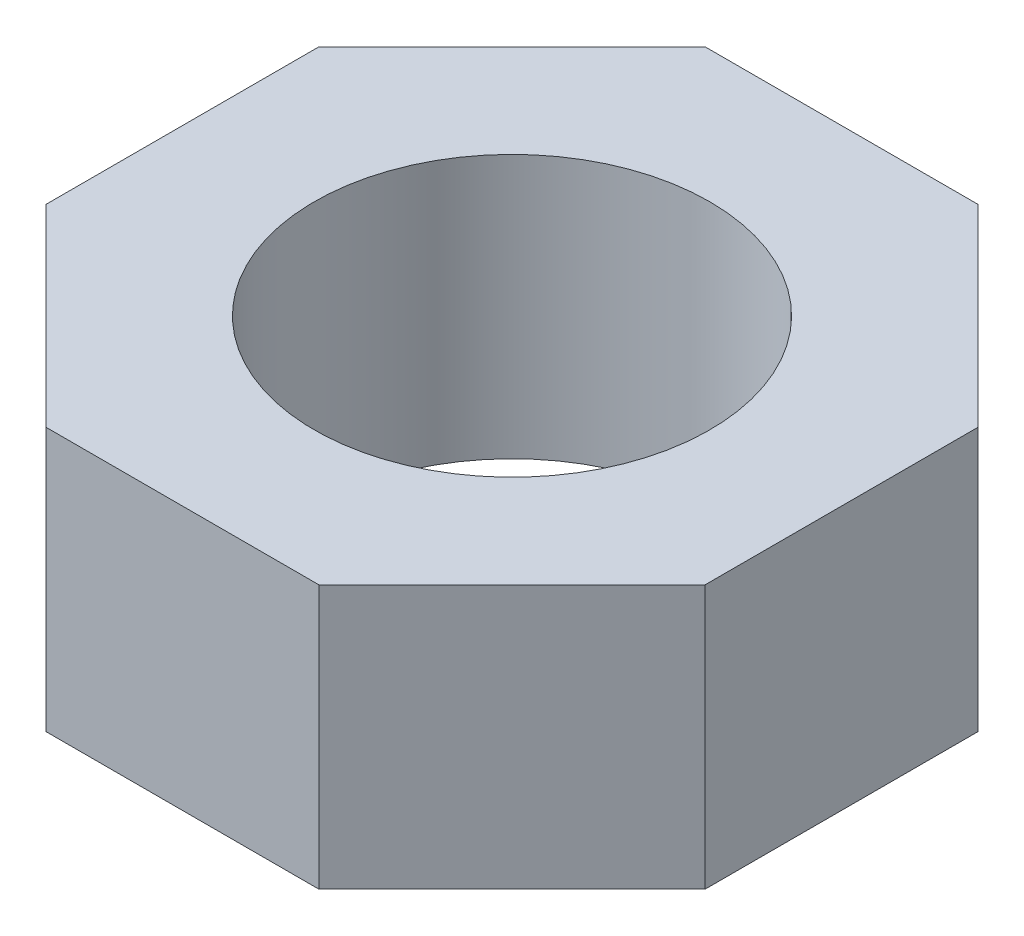
ISO-10303-21;
HEADER;
FILE_DESCRIPTION(('STEP AP214'),'2;1');
FILE_NAME('part.step','',(''),(''),'','','');
FILE_SCHEMA(('AUTOMOTIVE_DESIGN { 1 0 10303 214 1 1 1 1 }'));
ENDSEC;
DATA;
#1=APPLICATION_CONTEXT('core data for automotive mechanical design processes');
#2=APPLICATION_PROTOCOL_DEFINITION('international standard','automotive_design',2000,#1);
#3=PRODUCT_CONTEXT('',#1,'mechanical');
#4=PRODUCT('Part','Part','',(#3));
#5=PRODUCT_RELATED_PRODUCT_CATEGORY('part','',(#4));
#6=PRODUCT_DEFINITION_FORMATION('','',#4);
#7=PRODUCT_DEFINITION_CONTEXT('part definition',#1,'design');
#8=PRODUCT_DEFINITION('design','',#6,#7);
#9=PRODUCT_DEFINITION_SHAPE('','',#8);
#10=(LENGTH_UNIT() NAMED_UNIT(*) SI_UNIT(.MILLI.,.METRE.));
#11=(NAMED_UNIT(*) PLANE_ANGLE_UNIT() SI_UNIT($,.RADIAN.));
#12=(NAMED_UNIT(*) SI_UNIT($,.STERADIAN.) SOLID_ANGLE_UNIT());
#13=UNCERTAINTY_MEASURE_WITH_UNIT(LENGTH_MEASURE(1.E-05),#10,'distance_accuracy_value','');
#14=(GEOMETRIC_REPRESENTATION_CONTEXT(3) GLOBAL_UNCERTAINTY_ASSIGNED_CONTEXT((#13)) GLOBAL_UNIT_ASSIGNED_CONTEXT((#10,
#11,#12)) REPRESENTATION_CONTEXT('',''));
#15=CARTESIAN_POINT('',(0.,0.,0.));
#16=DIRECTION('',(0.,0.,1.));
#17=DIRECTION('',(1.,0.,0.));
#18=AXIS2_PLACEMENT_3D('',#15,#16,#17);
#19=CARTESIAN_POINT('',(-2.5,1.,-1.03553390593274));
#20=DIRECTION('',(0.707106781186547,0.,0.707106781186549));
#21=DIRECTION('',(0.707106781186549,0.,-0.707106781186547));
#22=AXIS2_PLACEMENT_3D('',#19,#20,#21);
#23=PLANE('',#22);
#24=DIRECTION('',(-0.707106781186549,0.,0.707106781186547));
#25=VECTOR('',#24,1.);
#26=CARTESIAN_POINT('',(-2.5,-1.,-1.03553390593274));
#27=LINE('',#26,#25);
#28=CARTESIAN_POINT('',(-1.03553390593274,-1.,-2.5));
#29=VERTEX_POINT('',#28);
#30=CARTESIAN_POINT('',(-2.5,-1.,-1.03553390593274));
#31=VERTEX_POINT('',#30);
#32=EDGE_CURVE('E128',#29,#31,#27,.T.);
#33=ORIENTED_EDGE('',*,*,#32,.T.);
#34=DIRECTION('',(0.,-1.,0.));
#35=VECTOR('',#34,1.);
#36=CARTESIAN_POINT('',(-2.5,1.,-1.03553390593274));
#37=LINE('',#36,#35);
#38=CARTESIAN_POINT('',(-2.5,1.,-1.03553390593274));
#39=VERTEX_POINT('',#38);
#40=EDGE_CURVE('E11',#39,#31,#37,.T.);
#41=ORIENTED_EDGE('',*,*,#40,.F.);
#42=DIRECTION('',(-0.707106781186549,0.,0.707106781186547));
#43=VECTOR('',#42,1.);
#44=CARTESIAN_POINT('',(-2.5,1.,-1.03553390593274));
#45=LINE('',#44,#43);
#46=CARTESIAN_POINT('',(-1.03553390593274,1.,-2.5));
#47=VERTEX_POINT('',#46);
#48=EDGE_CURVE('E143',#47,#39,#45,.T.);
#49=ORIENTED_EDGE('',*,*,#48,.F.);
#50=DIRECTION('',(0.,-1.,0.));
#51=VECTOR('',#50,1.);
#52=CARTESIAN_POINT('',(-1.03553390593274,1.,-2.5));
#53=LINE('',#52,#51);
#54=EDGE_CURVE('E124',#47,#29,#53,.T.);
#55=ORIENTED_EDGE('',*,*,#54,.T.);
#56=EDGE_LOOP('',(#33,#41,#49,#55));
#57=FACE_BOUND('',#56,.T.);
#58=ADVANCED_FACE('F32',(#57),#23,.F.);
#59=CARTESIAN_POINT('',(-2.5,1.,1.03553390593274));
#60=DIRECTION('',(1.,0.,0.));
#61=DIRECTION('',(0.,0.,-1.));
#62=AXIS2_PLACEMENT_3D('',#59,#60,#61);
#63=PLANE('',#62);
#64=DIRECTION('',(0.,0.,1.));
#65=VECTOR('',#64,1.);
#66=CARTESIAN_POINT('',(-2.5,-1.,1.03553390593274));
#67=LINE('',#66,#65);
#68=CARTESIAN_POINT('',(-2.5,-1.,1.03553390593274));
#69=VERTEX_POINT('',#68);
#70=EDGE_CURVE('E131',#31,#69,#67,.T.);
#71=ORIENTED_EDGE('',*,*,#70,.T.);
#72=DIRECTION('',(0.,-1.,0.));
#73=VECTOR('',#72,1.);
#74=CARTESIAN_POINT('',(-2.5,1.,1.03553390593274));
#75=LINE('',#74,#73);
#76=CARTESIAN_POINT('',(-2.5,1.,1.03553390593274));
#77=VERTEX_POINT('',#76);
#78=EDGE_CURVE('E40',#77,#69,#75,.T.);
#79=ORIENTED_EDGE('',*,*,#78,.F.);
#80=DIRECTION('',(0.,0.,1.));
#81=VECTOR('',#80,1.);
#82=CARTESIAN_POINT('',(-2.5,1.,1.03553390593274));
#83=LINE('',#82,#81);
#84=EDGE_CURVE('E91',#39,#77,#83,.T.);
#85=ORIENTED_EDGE('',*,*,#84,.F.);
#86=ORIENTED_EDGE('',*,*,#40,.T.);
#87=EDGE_LOOP('',(#71,#79,#85,#86));
#88=FACE_BOUND('',#87,.T.);
#89=ADVANCED_FACE('F198',(#88),#63,.F.);
#90=CARTESIAN_POINT('',(-1.03553390593274,1.,2.5));
#91=DIRECTION('',(0.707106781186547,0.,-0.707106781186548));
#92=DIRECTION('',(-0.707106781186548,0.,-0.707106781186547));
#93=AXIS2_PLACEMENT_3D('',#90,#91,#92);
#94=PLANE('',#93);
#95=DIRECTION('',(0.707106781186548,0.,0.707106781186547));
#96=VECTOR('',#95,1.);
#97=CARTESIAN_POINT('',(-1.03553390593274,-1.,2.5));
#98=LINE('',#97,#96);
#99=CARTESIAN_POINT('',(-1.03553390593274,-1.,2.5));
#100=VERTEX_POINT('',#99);
#101=EDGE_CURVE('E134',#69,#100,#98,.T.);
#102=ORIENTED_EDGE('',*,*,#101,.T.);
#103=DIRECTION('',(0.,-1.,0.));
#104=VECTOR('',#103,1.);
#105=CARTESIAN_POINT('',(-1.03553390593274,1.,2.5));
#106=LINE('',#105,#104);
#107=CARTESIAN_POINT('',(-1.03553390593274,1.,2.5));
#108=VERTEX_POINT('',#107);
#109=EDGE_CURVE('E150',#108,#100,#106,.T.);
#110=ORIENTED_EDGE('',*,*,#109,.F.);
#111=DIRECTION('',(0.707106781186548,0.,0.707106781186547));
#112=VECTOR('',#111,1.);
#113=CARTESIAN_POINT('',(-1.03553390593274,1.,2.5));
#114=LINE('',#113,#112);
#115=EDGE_CURVE('E158',#77,#108,#114,.T.);
#116=ORIENTED_EDGE('',*,*,#115,.F.);
#117=ORIENTED_EDGE('',*,*,#78,.T.);
#118=EDGE_LOOP('',(#102,#110,#116,#117));
#119=FACE_BOUND('',#118,.T.);
#120=ADVANCED_FACE('F156',(#119),#94,.F.);
#121=CARTESIAN_POINT('',(1.03553390593274,1.,2.5));
#122=DIRECTION('',(0.,0.,-1.));
#123=DIRECTION('',(-1.,0.,0.));
#124=AXIS2_PLACEMENT_3D('',#121,#122,#123);
#125=PLANE('',#124);
#126=DIRECTION('',(1.,0.,0.));
#127=VECTOR('',#126,1.);
#128=CARTESIAN_POINT('',(1.03553390593274,-1.,2.5));
#129=LINE('',#128,#127);
#130=CARTESIAN_POINT('',(1.03553390593274,-1.,2.5));
#131=VERTEX_POINT('',#130);
#132=EDGE_CURVE('E136',#100,#131,#129,.T.);
#133=ORIENTED_EDGE('',*,*,#132,.T.);
#134=DIRECTION('',(0.,-1.,0.));
#135=VECTOR('',#134,1.);
#136=CARTESIAN_POINT('',(1.03553390593274,1.,2.5));
#137=LINE('',#136,#135);
#138=CARTESIAN_POINT('',(1.03553390593274,1.,2.5));
#139=VERTEX_POINT('',#138);
#140=EDGE_CURVE('E147',#139,#131,#137,.T.);
#141=ORIENTED_EDGE('',*,*,#140,.F.);
#142=DIRECTION('',(1.,0.,0.));
#143=VECTOR('',#142,1.);
#144=CARTESIAN_POINT('',(1.03553390593274,1.,2.5));
#145=LINE('',#144,#143);
#146=EDGE_CURVE('E170',#108,#139,#145,.T.);
#147=ORIENTED_EDGE('',*,*,#146,.F.);
#148=ORIENTED_EDGE('',*,*,#109,.T.);
#149=EDGE_LOOP('',(#133,#141,#147,#148));
#150=FACE_BOUND('',#149,.T.);
#151=ADVANCED_FACE('F166',(#150),#125,.F.);
#152=CARTESIAN_POINT('',(2.5,1.,1.03553390593274));
#153=DIRECTION('',(-0.707106781186547,0.,-0.707106781186548));
#154=DIRECTION('',(-0.707106781186548,0.,0.707106781186547));
#155=AXIS2_PLACEMENT_3D('',#152,#153,#154);
#156=PLANE('',#155);
#157=DIRECTION('',(0.707106781186548,0.,-0.707106781186547));
#158=VECTOR('',#157,1.);
#159=CARTESIAN_POINT('',(2.5,-1.,1.03553390593274));
#160=LINE('',#159,#158);
#161=CARTESIAN_POINT('',(2.5,-1.,1.03553390593274));
#162=VERTEX_POINT('',#161);
#163=EDGE_CURVE('E138',#131,#162,#160,.T.);
#164=ORIENTED_EDGE('',*,*,#163,.T.);
#165=DIRECTION('',(0.,-1.,0.));
#166=VECTOR('',#165,1.);
#167=CARTESIAN_POINT('',(2.5,1.,1.03553390593274));
#168=LINE('',#167,#166);
#169=CARTESIAN_POINT('',(2.5,1.,1.03553390593274));
#170=VERTEX_POINT('',#169);
#171=EDGE_CURVE('E119',#170,#162,#168,.T.);
#172=ORIENTED_EDGE('',*,*,#171,.F.);
#173=DIRECTION('',(0.707106781186548,0.,-0.707106781186547));
#174=VECTOR('',#173,1.);
#175=CARTESIAN_POINT('',(2.5,1.,1.03553390593274));
#176=LINE('',#175,#174);
#177=EDGE_CURVE('E110',#139,#170,#176,.T.);
#178=ORIENTED_EDGE('',*,*,#177,.F.);
#179=ORIENTED_EDGE('',*,*,#140,.T.);
#180=EDGE_LOOP('',(#164,#172,#178,#179));
#181=FACE_BOUND('',#180,.T.);
#182=ADVANCED_FACE('F169',(#181),#156,.F.);
#183=CARTESIAN_POINT('',(2.5,1.,-1.03553390593274));
#184=DIRECTION('',(-1.,0.,0.));
#185=DIRECTION('',(0.,0.,1.));
#186=AXIS2_PLACEMENT_3D('',#183,#184,#185);
#187=PLANE('',#186);
#188=DIRECTION('',(0.,0.,-1.));
#189=VECTOR('',#188,1.);
#190=CARTESIAN_POINT('',(2.5,-1.,-1.03553390593274));
#191=LINE('',#190,#189);
#192=CARTESIAN_POINT('',(2.5,-1.,-1.03553390593274));
#193=VERTEX_POINT('',#192);
#194=EDGE_CURVE('E118',#162,#193,#191,.T.);
#195=ORIENTED_EDGE('',*,*,#194,.T.);
#196=DIRECTION('',(0.,-1.,0.));
#197=VECTOR('',#196,1.);
#198=CARTESIAN_POINT('',(2.5,1.,-1.03553390593274));
#199=LINE('',#198,#197);
#200=CARTESIAN_POINT('',(2.5,1.,-1.03553390593274));
#201=VERTEX_POINT('',#200);
#202=EDGE_CURVE('E115',#201,#193,#199,.T.);
#203=ORIENTED_EDGE('',*,*,#202,.F.);
#204=DIRECTION('',(0.,0.,-1.));
#205=VECTOR('',#204,1.);
#206=CARTESIAN_POINT('',(2.5,1.,-1.03553390593274));
#207=LINE('',#206,#205);
#208=EDGE_CURVE('E104',#170,#201,#207,.T.);
#209=ORIENTED_EDGE('',*,*,#208,.F.);
#210=ORIENTED_EDGE('',*,*,#171,.T.);
#211=EDGE_LOOP('',(#195,#203,#209,#210));
#212=FACE_BOUND('',#211,.T.);
#213=ADVANCED_FACE('F116',(#212),#187,.F.);
#214=CARTESIAN_POINT('',(1.03553390593274,1.,-2.5));
#215=DIRECTION('',(-0.707106781186547,0.,0.707106781186548));
#216=DIRECTION('',(0.707106781186548,0.,0.707106781186547));
#217=AXIS2_PLACEMENT_3D('',#214,#215,#216);
#218=PLANE('',#217);
#219=DIRECTION('',(-0.707106781186548,0.,-0.707106781186547));
#220=VECTOR('',#219,1.);
#221=CARTESIAN_POINT('',(1.03553390593274,-1.,-2.5));
#222=LINE('',#221,#220);
#223=CARTESIAN_POINT('',(1.03553390593274,-1.,-2.5));
#224=VERTEX_POINT('',#223);
#225=EDGE_CURVE('E77',#193,#224,#222,.T.);
#226=ORIENTED_EDGE('',*,*,#225,.T.);
#227=DIRECTION('',(0.,-1.,0.));
#228=VECTOR('',#227,1.);
#229=CARTESIAN_POINT('',(1.03553390593274,1.,-2.5));
#230=LINE('',#229,#228);
#231=CARTESIAN_POINT('',(1.03553390593274,1.,-2.5));
#232=VERTEX_POINT('',#231);
#233=EDGE_CURVE('E120',#232,#224,#230,.T.);
#234=ORIENTED_EDGE('',*,*,#233,.F.);
#235=DIRECTION('',(-0.707106781186548,0.,-0.707106781186547));
#236=VECTOR('',#235,1.);
#237=CARTESIAN_POINT('',(1.03553390593274,1.,-2.5));
#238=LINE('',#237,#236);
#239=EDGE_CURVE('E108',#201,#232,#238,.T.);
#240=ORIENTED_EDGE('',*,*,#239,.F.);
#241=ORIENTED_EDGE('',*,*,#202,.T.);
#242=EDGE_LOOP('',(#226,#234,#240,#241));
#243=FACE_BOUND('',#242,.T.);
#244=ADVANCED_FACE('F122',(#243),#218,.F.);
#245=CARTESIAN_POINT('',(-1.03553390593274,1.,-2.5));
#246=DIRECTION('',(0.,0.,1.));
#247=DIRECTION('',(1.,0.,0.));
#248=AXIS2_PLACEMENT_3D('',#245,#246,#247);
#249=PLANE('',#248);
#250=DIRECTION('',(-1.,0.,0.));
#251=VECTOR('',#250,1.);
#252=CARTESIAN_POINT('',(-1.03553390593274,-1.,-2.5));
#253=LINE('',#252,#251);
#254=EDGE_CURVE('E83',#224,#29,#253,.T.);
#255=ORIENTED_EDGE('',*,*,#254,.T.);
#256=ORIENTED_EDGE('',*,*,#54,.F.);
#257=DIRECTION('',(-1.,0.,0.));
#258=VECTOR('',#257,1.);
#259=CARTESIAN_POINT('',(-1.03553390593274,1.,-2.5));
#260=LINE('',#259,#258);
#261=EDGE_CURVE('E48',#232,#47,#260,.T.);
#262=ORIENTED_EDGE('',*,*,#261,.F.);
#263=ORIENTED_EDGE('',*,*,#233,.T.);
#264=EDGE_LOOP('',(#255,#256,#262,#263));
#265=FACE_BOUND('',#264,.T.);
#266=ADVANCED_FACE('F194',(#265),#249,.F.);
#267=CARTESIAN_POINT('',(-3.53553390593274,1.,0.));
#268=DIRECTION('',(0.,1.,0.));
#269=DIRECTION('',(0.,0.,1.));
#270=AXIS2_PLACEMENT_3D('',#267,#268,#269);
#271=PLANE('',#270);
#272=CARTESIAN_POINT('',(0.,1.,0.));
#273=DIRECTION('',(0.,-1.,0.));
#274=DIRECTION('',(0.,0.,-1.));
#275=AXIS2_PLACEMENT_3D('',#272,#273,#274);
#276=CIRCLE('',#275,1.5);
#277=CARTESIAN_POINT('',(0.,1.,-1.5));
#278=VERTEX_POINT('',#277);
#279=EDGE_CURVE('E132',#278,#278,#276,.T.);
#280=ORIENTED_EDGE('',*,*,#279,.T.);
#281=EDGE_LOOP('',(#280));
#282=FACE_BOUND('',#281,.T.);
#283=ORIENTED_EDGE('',*,*,#48,.T.);
#284=ORIENTED_EDGE('',*,*,#84,.T.);
#285=ORIENTED_EDGE('',*,*,#115,.T.);
#286=ORIENTED_EDGE('',*,*,#146,.T.);
#287=ORIENTED_EDGE('',*,*,#177,.T.);
#288=ORIENTED_EDGE('',*,*,#208,.T.);
#289=ORIENTED_EDGE('',*,*,#239,.T.);
#290=ORIENTED_EDGE('',*,*,#261,.T.);
#291=EDGE_LOOP('',(#283,#284,#285,#286,#287,#288,#289,#290));
#292=FACE_BOUND('',#291,.T.);
#293=ADVANCED_FACE('F106',(#282,#292),#271,.T.);
#294=CARTESIAN_POINT('',(-3.53553390593274,-1.,0.));
#295=DIRECTION('',(0.,1.,0.));
#296=DIRECTION('',(0.,0.,1.));
#297=AXIS2_PLACEMENT_3D('',#294,#295,#296);
#298=PLANE('',#297);
#299=CARTESIAN_POINT('',(0.,-1.,0.));
#300=DIRECTION('',(0.,-1.,0.));
#301=DIRECTION('',(0.,0.,-1.));
#302=AXIS2_PLACEMENT_3D('',#299,#300,#301);
#303=CIRCLE('',#302,1.5);
#304=CARTESIAN_POINT('',(0.,-1.,-1.5));
#305=VERTEX_POINT('',#304);
#306=EDGE_CURVE('E176',#305,#305,#303,.T.);
#307=ORIENTED_EDGE('',*,*,#306,.F.);
#308=EDGE_LOOP('',(#307));
#309=FACE_BOUND('',#308,.T.);
#310=ORIENTED_EDGE('',*,*,#32,.F.);
#311=ORIENTED_EDGE('',*,*,#254,.F.);
#312=ORIENTED_EDGE('',*,*,#225,.F.);
#313=ORIENTED_EDGE('',*,*,#194,.F.);
#314=ORIENTED_EDGE('',*,*,#163,.F.);
#315=ORIENTED_EDGE('',*,*,#132,.F.);
#316=ORIENTED_EDGE('',*,*,#101,.F.);
#317=ORIENTED_EDGE('',*,*,#70,.F.);
#318=EDGE_LOOP('',(#310,#311,#312,#313,#314,#315,#316,#317));
#319=FACE_BOUND('',#318,.T.);
#320=ADVANCED_FACE('F162',(#309,#319),#298,.F.);
#321=CARTESIAN_POINT('',(0.,1.,0.));
#322=DIRECTION('',(0.,-1.,0.));
#323=DIRECTION('',(0.,0.,-1.));
#324=AXIS2_PLACEMENT_3D('',#321,#322,#323);
#325=CYLINDRICAL_SURFACE('',#324,1.5);
#326=ORIENTED_EDGE('',*,*,#279,.F.);
#327=EDGE_LOOP('',(#326));
#328=FACE_BOUND('',#327,.T.);
#329=ORIENTED_EDGE('',*,*,#306,.T.);
#330=EDGE_LOOP('',(#329));
#331=FACE_BOUND('',#330,.T.);
#332=ADVANCED_FACE('F183',(#328,#331),#325,.F.);
#333=CLOSED_SHELL('',(#58,#89,#120,#151,#182,#213,#244,#266,#293,#320,#332));
#334=MANIFOLD_SOLID_BREP('B2',#333);
#335=ADVANCED_BREP_SHAPE_REPRESENTATION('',(#18,#334),#14);
#336=SHAPE_DEFINITION_REPRESENTATION(#9,#335);
ENDSEC;
END-ISO-10303-21;
